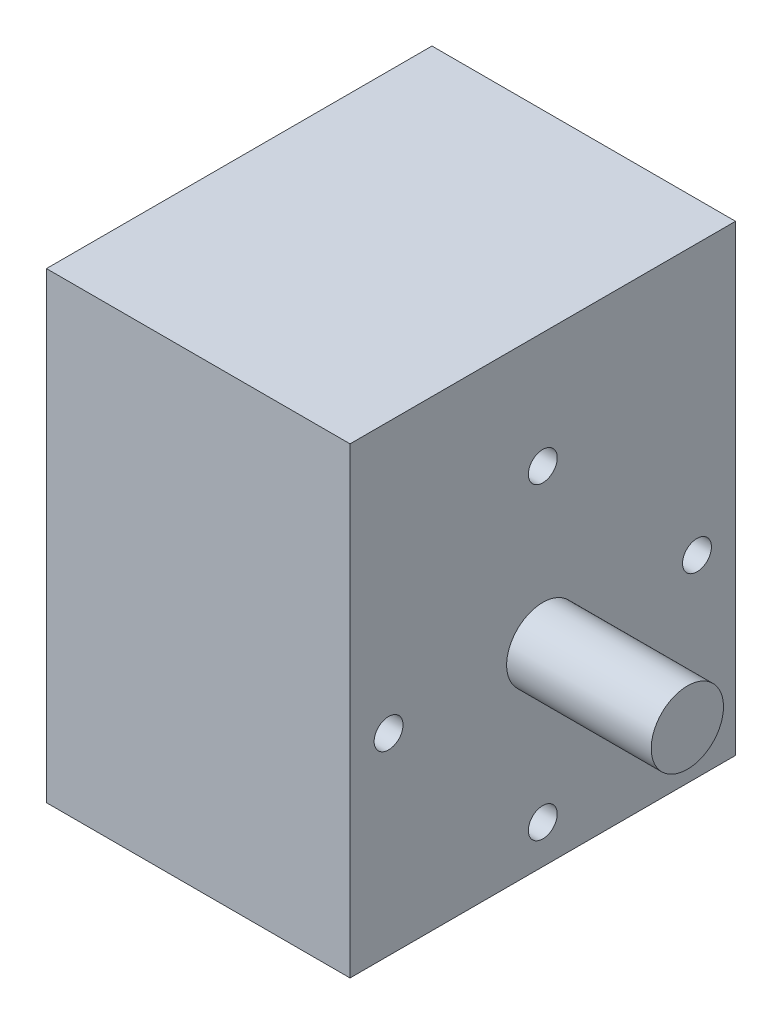
ISO-10303-21;
HEADER;
FILE_DESCRIPTION(('STEP AP214'),'2;1');
FILE_NAME('part.step','',(''),(''),'','','');
FILE_SCHEMA(('AUTOMOTIVE_DESIGN { 1 0 10303 214 1 1 1 1 }'));
ENDSEC;
DATA;
#1=APPLICATION_CONTEXT('core data for automotive mechanical design processes');
#2=APPLICATION_PROTOCOL_DEFINITION('international standard','automotive_design',2000,#1);
#3=PRODUCT_CONTEXT('',#1,'mechanical');
#4=PRODUCT('Part','Part','',(#3));
#5=PRODUCT_RELATED_PRODUCT_CATEGORY('part','',(#4));
#6=PRODUCT_DEFINITION_FORMATION('','',#4);
#7=PRODUCT_DEFINITION_CONTEXT('part definition',#1,'design');
#8=PRODUCT_DEFINITION('design','',#6,#7);
#9=PRODUCT_DEFINITION_SHAPE('','',#8);
#10=(LENGTH_UNIT() NAMED_UNIT(*) SI_UNIT(.MILLI.,.METRE.));
#11=(NAMED_UNIT(*) PLANE_ANGLE_UNIT() SI_UNIT($,.RADIAN.));
#12=(NAMED_UNIT(*) SI_UNIT($,.STERADIAN.) SOLID_ANGLE_UNIT());
#13=UNCERTAINTY_MEASURE_WITH_UNIT(LENGTH_MEASURE(1.E-05),#10,'distance_accuracy_value','');
#14=(GEOMETRIC_REPRESENTATION_CONTEXT(3) GLOBAL_UNCERTAINTY_ASSIGNED_CONTEXT((#13)) GLOBAL_UNIT_ASSIGNED_CONTEXT((#10,
#11,#12)) REPRESENTATION_CONTEXT('',''));
#15=CARTESIAN_POINT('',(0.,0.,0.));
#16=DIRECTION('',(0.,0.,1.));
#17=DIRECTION('',(1.,0.,0.));
#18=AXIS2_PLACEMENT_3D('',#15,#16,#17);
#19=CARTESIAN_POINT('',(-63.,56.,40.));
#20=DIRECTION('',(0.,0.,1.));
#21=DIRECTION('',(0.,-1.,0.));
#22=AXIS2_PLACEMENT_3D('',#19,#20,#21);
#23=PLANE('',#22);
#24=DIRECTION('',(0.,-1.,0.));
#25=VECTOR('',#24,1.);
#26=CARTESIAN_POINT('',(0.,56.,40.));
#27=LINE('',#26,#25);
#28=CARTESIAN_POINT('',(0.,56.,40.));
#29=VERTEX_POINT('',#28);
#30=CARTESIAN_POINT('',(0.,-40.,40.));
#31=VERTEX_POINT('',#30);
#32=EDGE_CURVE('E98',#29,#31,#27,.T.);
#33=ORIENTED_EDGE('',*,*,#32,.F.);
#34=DIRECTION('',(1.,0.,0.));
#35=VECTOR('',#34,1.);
#36=CARTESIAN_POINT('',(-63.,56.,40.));
#37=LINE('',#36,#35);
#38=CARTESIAN_POINT('',(-63.,56.,40.));
#39=VERTEX_POINT('',#38);
#40=EDGE_CURVE('E11',#39,#29,#37,.T.);
#41=ORIENTED_EDGE('',*,*,#40,.F.);
#42=DIRECTION('',(0.,-1.,0.));
#43=VECTOR('',#42,1.);
#44=CARTESIAN_POINT('',(-63.,56.,40.));
#45=LINE('',#44,#43);
#46=CARTESIAN_POINT('',(-63.,-40.,40.));
#47=VERTEX_POINT('',#46);
#48=EDGE_CURVE('E91',#39,#47,#45,.T.);
#49=ORIENTED_EDGE('',*,*,#48,.T.);
#50=DIRECTION('',(1.,0.,0.));
#51=VECTOR('',#50,1.);
#52=CARTESIAN_POINT('',(-63.,-40.,40.));
#53=LINE('',#52,#51);
#54=EDGE_CURVE('E36',#47,#31,#53,.T.);
#55=ORIENTED_EDGE('',*,*,#54,.T.);
#56=EDGE_LOOP('',(#33,#41,#49,#55));
#57=FACE_BOUND('',#56,.T.);
#58=ADVANCED_FACE('F33',(#57),#23,.T.);
#59=CARTESIAN_POINT('',(-63.,56.,40.));
#60=DIRECTION('',(0.,1.,0.));
#61=DIRECTION('',(0.,0.,1.));
#62=AXIS2_PLACEMENT_3D('',#59,#60,#61);
#63=PLANE('',#62);
#64=DIRECTION('',(0.,0.,1.));
#65=VECTOR('',#64,1.);
#66=CARTESIAN_POINT('',(0.,56.,40.));
#67=LINE('',#66,#65);
#68=CARTESIAN_POINT('',(0.,56.,-40.));
#69=VERTEX_POINT('',#68);
#70=EDGE_CURVE('E93',#69,#29,#67,.T.);
#71=ORIENTED_EDGE('',*,*,#70,.F.);
#72=DIRECTION('',(1.,0.,0.));
#73=VECTOR('',#72,1.);
#74=CARTESIAN_POINT('',(-63.,56.,-40.));
#75=LINE('',#74,#73);
#76=CARTESIAN_POINT('',(-63.,56.,-40.));
#77=VERTEX_POINT('',#76);
#78=EDGE_CURVE('E42',#77,#69,#75,.T.);
#79=ORIENTED_EDGE('',*,*,#78,.F.);
#80=DIRECTION('',(0.,0.,1.));
#81=VECTOR('',#80,1.);
#82=CARTESIAN_POINT('',(-63.,56.,40.));
#83=LINE('',#82,#81);
#84=EDGE_CURVE('E88',#77,#39,#83,.T.);
#85=ORIENTED_EDGE('',*,*,#84,.T.);
#86=ORIENTED_EDGE('',*,*,#40,.T.);
#87=EDGE_LOOP('',(#71,#79,#85,#86));
#88=FACE_BOUND('',#87,.T.);
#89=ADVANCED_FACE('F109',(#88),#63,.T.);
#90=CARTESIAN_POINT('',(-63.,56.,-40.));
#91=DIRECTION('',(0.,0.,-1.));
#92=DIRECTION('',(0.,1.,0.));
#93=AXIS2_PLACEMENT_3D('',#90,#91,#92);
#94=PLANE('',#93);
#95=DIRECTION('',(0.,1.,0.));
#96=VECTOR('',#95,1.);
#97=CARTESIAN_POINT('',(0.,56.,-40.));
#98=LINE('',#97,#96);
#99=CARTESIAN_POINT('',(0.,-40.,-40.));
#100=VERTEX_POINT('',#99);
#101=EDGE_CURVE('E83',#100,#69,#98,.T.);
#102=ORIENTED_EDGE('',*,*,#101,.F.);
#103=DIRECTION('',(1.,0.,0.));
#104=VECTOR('',#103,1.);
#105=CARTESIAN_POINT('',(-63.,-40.,-40.));
#106=LINE('',#105,#104);
#107=CARTESIAN_POINT('',(-63.,-40.,-40.));
#108=VERTEX_POINT('',#107);
#109=EDGE_CURVE('E78',#108,#100,#106,.T.);
#110=ORIENTED_EDGE('',*,*,#109,.F.);
#111=DIRECTION('',(0.,1.,0.));
#112=VECTOR('',#111,1.);
#113=CARTESIAN_POINT('',(-63.,56.,-40.));
#114=LINE('',#113,#112);
#115=EDGE_CURVE('E81',#108,#77,#114,.T.);
#116=ORIENTED_EDGE('',*,*,#115,.T.);
#117=ORIENTED_EDGE('',*,*,#78,.T.);
#118=EDGE_LOOP('',(#102,#110,#116,#117));
#119=FACE_BOUND('',#118,.T.);
#120=ADVANCED_FACE('F80',(#119),#94,.T.);
#121=CARTESIAN_POINT('',(-63.,-40.,40.));
#122=DIRECTION('',(0.,-1.,0.));
#123=DIRECTION('',(0.,0.,-1.));
#124=AXIS2_PLACEMENT_3D('',#121,#122,#123);
#125=PLANE('',#124);
#126=DIRECTION('',(0.,0.,-1.));
#127=VECTOR('',#126,1.);
#128=CARTESIAN_POINT('',(0.,-40.,40.));
#129=LINE('',#128,#127);
#130=EDGE_CURVE('E101',#31,#100,#129,.T.);
#131=ORIENTED_EDGE('',*,*,#130,.F.);
#132=ORIENTED_EDGE('',*,*,#54,.F.);
#133=DIRECTION('',(0.,0.,-1.));
#134=VECTOR('',#133,1.);
#135=CARTESIAN_POINT('',(-63.,-40.,40.));
#136=LINE('',#135,#134);
#137=EDGE_CURVE('E87',#47,#108,#136,.T.);
#138=ORIENTED_EDGE('',*,*,#137,.T.);
#139=ORIENTED_EDGE('',*,*,#109,.T.);
#140=EDGE_LOOP('',(#131,#132,#138,#139));
#141=FACE_BOUND('',#140,.T.);
#142=ADVANCED_FACE('F90',(#141),#125,.T.);
#143=CARTESIAN_POINT('',(-63.,0.,0.));
#144=DIRECTION('',(1.,0.,0.));
#145=DIRECTION('',(0.,0.,-1.));
#146=AXIS2_PLACEMENT_3D('',#143,#144,#145);
#147=PLANE('',#146);
#148=CARTESIAN_POINT('',(-63.,0.,-32.));
#149=DIRECTION('',(1.,0.,0.));
#150=DIRECTION('',(0.,0.,-1.));
#151=AXIS2_PLACEMENT_3D('',#148,#149,#150);
#152=CIRCLE('',#151,3.);
#153=CARTESIAN_POINT('',(-63.,0.,-35.));
#154=VERTEX_POINT('',#153);
#155=EDGE_CURVE('E163',#154,#154,#152,.T.);
#156=ORIENTED_EDGE('',*,*,#155,.T.);
#157=EDGE_LOOP('',(#156));
#158=FACE_BOUND('',#157,.T.);
#159=CARTESIAN_POINT('',(-63.,-32.,0.));
#160=DIRECTION('',(1.,0.,0.));
#161=DIRECTION('',(0.,0.,-1.));
#162=AXIS2_PLACEMENT_3D('',#159,#160,#161);
#163=CIRCLE('',#162,3.);
#164=CARTESIAN_POINT('',(-63.,-32.,-3.));
#165=VERTEX_POINT('',#164);
#166=EDGE_CURVE('E170',#165,#165,#163,.T.);
#167=ORIENTED_EDGE('',*,*,#166,.T.);
#168=EDGE_LOOP('',(#167));
#169=FACE_BOUND('',#168,.T.);
#170=CARTESIAN_POINT('',(-63.,0.,32.));
#171=DIRECTION('',(1.,0.,0.));
#172=DIRECTION('',(0.,0.,-1.));
#173=AXIS2_PLACEMENT_3D('',#170,#171,#172);
#174=CIRCLE('',#173,3.);
#175=CARTESIAN_POINT('',(-63.,0.,29.));
#176=VERTEX_POINT('',#175);
#177=EDGE_CURVE('E176',#176,#176,#174,.T.);
#178=ORIENTED_EDGE('',*,*,#177,.T.);
#179=EDGE_LOOP('',(#178));
#180=FACE_BOUND('',#179,.T.);
#181=CARTESIAN_POINT('',(-63.,32.,0.));
#182=DIRECTION('',(1.,0.,0.));
#183=DIRECTION('',(0.,0.,-1.));
#184=AXIS2_PLACEMENT_3D('',#181,#182,#183);
#185=CIRCLE('',#184,3.);
#186=CARTESIAN_POINT('',(-63.,32.,-3.));
#187=VERTEX_POINT('',#186);
#188=EDGE_CURVE('E102',#187,#187,#185,.T.);
#189=ORIENTED_EDGE('',*,*,#188,.T.);
#190=EDGE_LOOP('',(#189));
#191=FACE_BOUND('',#190,.T.);
#192=ORIENTED_EDGE('',*,*,#48,.F.);
#193=ORIENTED_EDGE('',*,*,#84,.F.);
#194=ORIENTED_EDGE('',*,*,#115,.F.);
#195=ORIENTED_EDGE('',*,*,#137,.F.);
#196=EDGE_LOOP('',(#192,#193,#194,#195));
#197=FACE_BOUND('',#196,.T.);
#198=ADVANCED_FACE('F86',(#158,#169,#180,#191,#197),#147,.F.);
#199=CARTESIAN_POINT('',(0.,0.,0.));
#200=DIRECTION('',(1.,0.,0.));
#201=DIRECTION('',(0.,0.,-1.));
#202=AXIS2_PLACEMENT_3D('',#199,#200,#201);
#203=PLANE('',#202);
#204=CARTESIAN_POINT('',(0.,0.,0.));
#205=DIRECTION('',(1.,0.,0.));
#206=DIRECTION('',(0.,0.,-1.));
#207=AXIS2_PLACEMENT_3D('',#204,#205,#206);
#208=CIRCLE('',#207,7.5);
#209=CARTESIAN_POINT('',(0.,0.,-7.5));
#210=VERTEX_POINT('',#209);
#211=EDGE_CURVE('E160',#210,#210,#208,.T.);
#212=ORIENTED_EDGE('',*,*,#211,.F.);
#213=EDGE_LOOP('',(#212));
#214=FACE_BOUND('',#213,.T.);
#215=CARTESIAN_POINT('',(0.,0.,-32.));
#216=DIRECTION('',(1.,0.,0.));
#217=DIRECTION('',(0.,0.,-1.));
#218=AXIS2_PLACEMENT_3D('',#215,#216,#217);
#219=CIRCLE('',#218,3.);
#220=CARTESIAN_POINT('',(0.,0.,-35.));
#221=VERTEX_POINT('',#220);
#222=EDGE_CURVE('E159',#221,#221,#219,.T.);
#223=ORIENTED_EDGE('',*,*,#222,.F.);
#224=EDGE_LOOP('',(#223));
#225=FACE_BOUND('',#224,.T.);
#226=CARTESIAN_POINT('',(0.,-32.,0.));
#227=DIRECTION('',(1.,0.,0.));
#228=DIRECTION('',(0.,0.,-1.));
#229=AXIS2_PLACEMENT_3D('',#226,#227,#228);
#230=CIRCLE('',#229,3.);
#231=CARTESIAN_POINT('',(0.,-32.,-3.));
#232=VERTEX_POINT('',#231);
#233=EDGE_CURVE('E168',#232,#232,#230,.T.);
#234=ORIENTED_EDGE('',*,*,#233,.F.);
#235=EDGE_LOOP('',(#234));
#236=FACE_BOUND('',#235,.T.);
#237=CARTESIAN_POINT('',(0.,0.,32.));
#238=DIRECTION('',(1.,0.,0.));
#239=DIRECTION('',(0.,0.,-1.));
#240=AXIS2_PLACEMENT_3D('',#237,#238,#239);
#241=CIRCLE('',#240,3.);
#242=CARTESIAN_POINT('',(0.,0.,29.));
#243=VERTEX_POINT('',#242);
#244=EDGE_CURVE('E173',#243,#243,#241,.T.);
#245=ORIENTED_EDGE('',*,*,#244,.F.);
#246=EDGE_LOOP('',(#245));
#247=FACE_BOUND('',#246,.T.);
#248=CARTESIAN_POINT('',(0.,32.,0.));
#249=DIRECTION('',(1.,0.,0.));
#250=DIRECTION('',(0.,0.,-1.));
#251=AXIS2_PLACEMENT_3D('',#248,#249,#250);
#252=CIRCLE('',#251,3.);
#253=CARTESIAN_POINT('',(0.,32.,-3.));
#254=VERTEX_POINT('',#253);
#255=EDGE_CURVE('E179',#254,#254,#252,.T.);
#256=ORIENTED_EDGE('',*,*,#255,.F.);
#257=EDGE_LOOP('',(#256));
#258=FACE_BOUND('',#257,.T.);
#259=ORIENTED_EDGE('',*,*,#32,.T.);
#260=ORIENTED_EDGE('',*,*,#130,.T.);
#261=ORIENTED_EDGE('',*,*,#101,.T.);
#262=ORIENTED_EDGE('',*,*,#70,.T.);
#263=EDGE_LOOP('',(#259,#260,#261,#262));
#264=FACE_BOUND('',#263,.T.);
#265=ADVANCED_FACE('F108',(#214,#225,#236,#247,#258,#264),#203,.T.);
#266=CARTESIAN_POINT('',(-63.,32.,0.));
#267=DIRECTION('',(1.,0.,0.));
#268=DIRECTION('',(0.,0.,-1.));
#269=AXIS2_PLACEMENT_3D('',#266,#267,#268);
#270=CYLINDRICAL_SURFACE('',#269,3.);
#271=ORIENTED_EDGE('',*,*,#188,.F.);
#272=EDGE_LOOP('',(#271));
#273=FACE_BOUND('',#272,.T.);
#274=ORIENTED_EDGE('',*,*,#255,.T.);
#275=EDGE_LOOP('',(#274));
#276=FACE_BOUND('',#275,.T.);
#277=ADVANCED_FACE('F127',(#273,#276),#270,.F.);
#278=CARTESIAN_POINT('',(-63.,0.,32.));
#279=DIRECTION('',(1.,0.,0.));
#280=DIRECTION('',(0.,0.,-1.));
#281=AXIS2_PLACEMENT_3D('',#278,#279,#280);
#282=CYLINDRICAL_SURFACE('',#281,3.);
#283=ORIENTED_EDGE('',*,*,#177,.F.);
#284=EDGE_LOOP('',(#283));
#285=FACE_BOUND('',#284,.T.);
#286=ORIENTED_EDGE('',*,*,#244,.T.);
#287=EDGE_LOOP('',(#286));
#288=FACE_BOUND('',#287,.T.);
#289=ADVANCED_FACE('F134',(#285,#288),#282,.F.);
#290=CARTESIAN_POINT('',(-63.,-32.,0.));
#291=DIRECTION('',(1.,0.,0.));
#292=DIRECTION('',(0.,0.,-1.));
#293=AXIS2_PLACEMENT_3D('',#290,#291,#292);
#294=CYLINDRICAL_SURFACE('',#293,3.);
#295=ORIENTED_EDGE('',*,*,#166,.F.);
#296=EDGE_LOOP('',(#295));
#297=FACE_BOUND('',#296,.T.);
#298=ORIENTED_EDGE('',*,*,#233,.T.);
#299=EDGE_LOOP('',(#298));
#300=FACE_BOUND('',#299,.T.);
#301=ADVANCED_FACE('F138',(#297,#300),#294,.F.);
#302=CARTESIAN_POINT('',(-63.,0.,-32.));
#303=DIRECTION('',(1.,0.,0.));
#304=DIRECTION('',(0.,0.,-1.));
#305=AXIS2_PLACEMENT_3D('',#302,#303,#304);
#306=CYLINDRICAL_SURFACE('',#305,3.);
#307=ORIENTED_EDGE('',*,*,#155,.F.);
#308=EDGE_LOOP('',(#307));
#309=FACE_BOUND('',#308,.T.);
#310=ORIENTED_EDGE('',*,*,#222,.T.);
#311=EDGE_LOOP('',(#310));
#312=FACE_BOUND('',#311,.T.);
#313=ADVANCED_FACE('F142',(#309,#312),#306,.F.);
#314=CARTESIAN_POINT('',(30.,0.,0.));
#315=DIRECTION('',(-1.,0.,0.));
#316=DIRECTION('',(0.,0.,1.));
#317=AXIS2_PLACEMENT_3D('',#314,#315,#316);
#318=CYLINDRICAL_SURFACE('',#317,7.5);
#319=CARTESIAN_POINT('',(30.,0.,0.));
#320=DIRECTION('',(1.,0.,0.));
#321=DIRECTION('',(0.,0.,-1.));
#322=AXIS2_PLACEMENT_3D('',#319,#320,#321);
#323=CIRCLE('',#322,7.5);
#324=CARTESIAN_POINT('',(30.,0.,-7.5));
#325=VERTEX_POINT('',#324);
#326=EDGE_CURVE('E158',#325,#325,#323,.T.);
#327=ORIENTED_EDGE('',*,*,#326,.F.);
#328=EDGE_LOOP('',(#327));
#329=FACE_BOUND('',#328,.T.);
#330=ORIENTED_EDGE('',*,*,#211,.T.);
#331=EDGE_LOOP('',(#330));
#332=FACE_BOUND('',#331,.T.);
#333=ADVANCED_FACE('F146',(#329,#332),#318,.T.);
#334=CARTESIAN_POINT('',(30.,0.,0.));
#335=DIRECTION('',(1.,0.,0.));
#336=DIRECTION('',(0.,0.,-1.));
#337=AXIS2_PLACEMENT_3D('',#334,#335,#336);
#338=PLANE('',#337);
#339=ORIENTED_EDGE('',*,*,#326,.T.);
#340=EDGE_LOOP('',(#339));
#341=FACE_BOUND('',#340,.T.);
#342=ADVANCED_FACE('F150',(#341),#338,.T.);
#343=CLOSED_SHELL('',(#58,#89,#120,#142,#198,#265,#277,#289,#301,#313,#333,#342));
#344=MANIFOLD_SOLID_BREP('B2',#343);
#345=ADVANCED_BREP_SHAPE_REPRESENTATION('',(#18,#344),#14);
#346=SHAPE_DEFINITION_REPRESENTATION(#9,#345);
ENDSEC;
END-ISO-10303-21;
